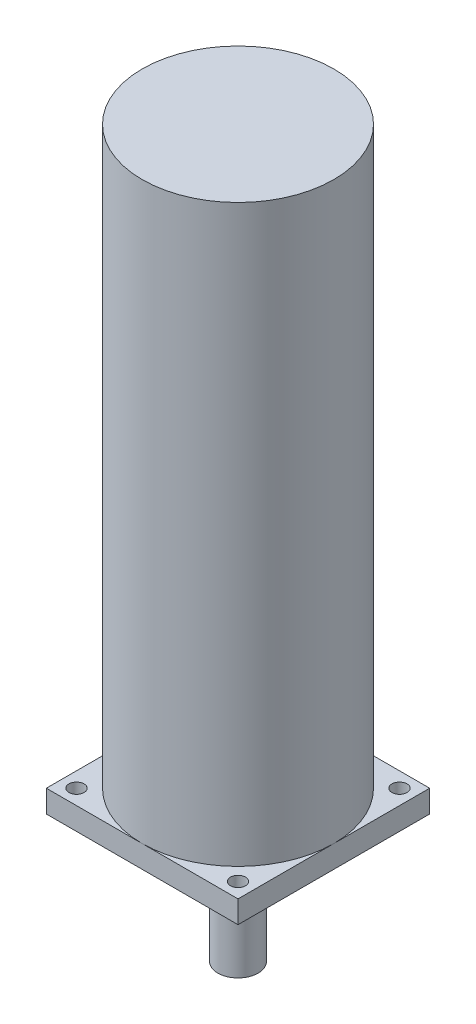
ISO-10303-21;
HEADER;
FILE_DESCRIPTION(('STEP AP214'),'2;1');
FILE_NAME('part.step','',(''),(''),'','','');
FILE_SCHEMA(('AUTOMOTIVE_DESIGN { 1 0 10303 214 1 1 1 1 }'));
ENDSEC;
DATA;
#1=APPLICATION_CONTEXT('core data for automotive mechanical design processes');
#2=APPLICATION_PROTOCOL_DEFINITION('international standard','automotive_design',2000,#1);
#3=PRODUCT_CONTEXT('',#1,'mechanical');
#4=PRODUCT('Part','Part','',(#3));
#5=PRODUCT_RELATED_PRODUCT_CATEGORY('part','',(#4));
#6=PRODUCT_DEFINITION_FORMATION('','',#4);
#7=PRODUCT_DEFINITION_CONTEXT('part definition',#1,'design');
#8=PRODUCT_DEFINITION('design','',#6,#7);
#9=PRODUCT_DEFINITION_SHAPE('','',#8);
#10=(LENGTH_UNIT() NAMED_UNIT(*) SI_UNIT(.MILLI.,.METRE.));
#11=(NAMED_UNIT(*) PLANE_ANGLE_UNIT() SI_UNIT($,.RADIAN.));
#12=(NAMED_UNIT(*) SI_UNIT($,.STERADIAN.) SOLID_ANGLE_UNIT());
#13=UNCERTAINTY_MEASURE_WITH_UNIT(LENGTH_MEASURE(1.E-05),#10,'distance_accuracy_value','');
#14=(GEOMETRIC_REPRESENTATION_CONTEXT(3) GLOBAL_UNCERTAINTY_ASSIGNED_CONTEXT((#13)) GLOBAL_UNIT_ASSIGNED_CONTEXT((#10,
#11,#12)) REPRESENTATION_CONTEXT('',''));
#15=CARTESIAN_POINT('',(0.,0.,0.));
#16=DIRECTION('',(0.,0.,1.));
#17=DIRECTION('',(1.,0.,0.));
#18=AXIS2_PLACEMENT_3D('',#15,#16,#17);
#19=CARTESIAN_POINT('',(0.,4.445,0.));
#20=DIRECTION('',(0.,-1.,0.));
#21=DIRECTION('',(0.,0.,-1.));
#22=AXIS2_PLACEMENT_3D('',#19,#20,#21);
#23=PLANE('',#22);
#24=CARTESIAN_POINT('',(0.,4.445,0.));
#25=DIRECTION('',(0.,1.,0.));
#26=DIRECTION('',(0.,0.,1.));
#27=AXIS2_PLACEMENT_3D('',#24,#25,#26);
#28=CIRCLE('',#27,19.05);
#29=CARTESIAN_POINT('',(0.,4.445,19.05));
#30=VERTEX_POINT('',#29);
#31=CARTESIAN_POINT('',(19.05,4.445,0.));
#32=VERTEX_POINT('',#31);
#33=EDGE_CURVE('E44',#30,#32,#28,.T.);
#34=ORIENTED_EDGE('',*,*,#33,.F.);
#35=DIRECTION('',(1.,0.,0.));
#36=VECTOR('',#35,1.);
#37=CARTESIAN_POINT('',(-19.05,4.445,19.05));
#38=LINE('',#37,#36);
#39=CARTESIAN_POINT('',(19.05,4.445,19.05));
#40=VERTEX_POINT('',#39);
#41=EDGE_CURVE('E96',#30,#40,#38,.T.);
#42=ORIENTED_EDGE('',*,*,#41,.T.);
#43=DIRECTION('',(0.,0.,-1.));
#44=VECTOR('',#43,1.);
#45=CARTESIAN_POINT('',(19.05,4.445,19.05));
#46=LINE('',#45,#44);
#47=EDGE_CURVE('E108',#40,#32,#46,.T.);
#48=ORIENTED_EDGE('',*,*,#47,.T.);
#49=EDGE_LOOP('',(#34,#42,#48));
#50=FACE_BOUND('',#49,.T.);
#51=CARTESIAN_POINT('',(16.050006,4.445,16.050006));
#52=DIRECTION('',(0.,1.,0.));
#53=DIRECTION('',(0.,0.,1.));
#54=AXIS2_PLACEMENT_3D('',#51,#52,#53);
#55=CIRCLE('',#54,1.499997);
#56=CARTESIAN_POINT('',(16.050006,4.445,17.550003));
#57=VERTEX_POINT('',#56);
#58=EDGE_CURVE('E125',#57,#57,#55,.T.);
#59=ORIENTED_EDGE('',*,*,#58,.F.);
#60=EDGE_LOOP('',(#59));
#61=FACE_BOUND('',#60,.T.);
#62=ADVANCED_FACE('F33',(#50,#61),#23,.F.);
#63=CARTESIAN_POINT('',(0.,4.445,-19.05));
#64=VERTEX_POINT('',#63);
#65=EDGE_CURVE('E11',#32,#64,#28,.T.);
#66=ORIENTED_EDGE('',*,*,#65,.F.);
#67=CARTESIAN_POINT('',(19.05,4.445,-19.05));
#68=VERTEX_POINT('',#67);
#69=EDGE_CURVE('E145',#32,#68,#46,.T.);
#70=ORIENTED_EDGE('',*,*,#69,.T.);
#71=DIRECTION('',(-1.,0.,0.));
#72=VECTOR('',#71,1.);
#73=CARTESIAN_POINT('',(-19.05,4.445,-19.05));
#74=LINE('',#73,#72);
#75=EDGE_CURVE('E146',#68,#64,#74,.T.);
#76=ORIENTED_EDGE('',*,*,#75,.T.);
#77=EDGE_LOOP('',(#66,#70,#76));
#78=FACE_BOUND('',#77,.T.);
#79=CARTESIAN_POINT('',(16.050006,4.445,-16.050006));
#80=DIRECTION('',(0.,1.,0.));
#81=DIRECTION('',(0.,0.,-1.));
#82=AXIS2_PLACEMENT_3D('',#79,#80,#81);
#83=CIRCLE('',#82,1.499997);
#84=CARTESIAN_POINT('',(16.050006,4.445,-17.550003));
#85=VERTEX_POINT('',#84);
#86=EDGE_CURVE('E131',#85,#85,#83,.T.);
#87=ORIENTED_EDGE('',*,*,#86,.F.);
#88=EDGE_LOOP('',(#87));
#89=FACE_BOUND('',#88,.T.);
#90=ADVANCED_FACE('F177',(#78,#89),#23,.F.);
#91=CARTESIAN_POINT('',(-19.05,4.445,0.));
#92=VERTEX_POINT('',#91);
#93=EDGE_CURVE('E42',#64,#92,#28,.T.);
#94=ORIENTED_EDGE('',*,*,#93,.F.);
#95=CARTESIAN_POINT('',(-19.05,4.445,-19.05));
#96=VERTEX_POINT('',#95);
#97=EDGE_CURVE('E144',#64,#96,#74,.T.);
#98=ORIENTED_EDGE('',*,*,#97,.T.);
#99=DIRECTION('',(0.,0.,1.));
#100=VECTOR('',#99,1.);
#101=CARTESIAN_POINT('',(-19.05,4.445,19.05));
#102=LINE('',#101,#100);
#103=EDGE_CURVE('E105',#96,#92,#102,.T.);
#104=ORIENTED_EDGE('',*,*,#103,.T.);
#105=EDGE_LOOP('',(#94,#98,#104));
#106=FACE_BOUND('',#105,.T.);
#107=CARTESIAN_POINT('',(-16.050006,4.445,-16.050006));
#108=DIRECTION('',(0.,1.,0.));
#109=DIRECTION('',(0.,0.,1.));
#110=AXIS2_PLACEMENT_3D('',#107,#108,#109);
#111=CIRCLE('',#110,1.499997);
#112=CARTESIAN_POINT('',(-16.050006,4.445,-14.550009));
#113=VERTEX_POINT('',#112);
#114=EDGE_CURVE('E137',#113,#113,#111,.T.);
#115=ORIENTED_EDGE('',*,*,#114,.F.);
#116=EDGE_LOOP('',(#115));
#117=FACE_BOUND('',#116,.T.);
#118=ADVANCED_FACE('F180',(#106,#117),#23,.F.);
#119=EDGE_CURVE('E51',#92,#30,#28,.T.);
#120=ORIENTED_EDGE('',*,*,#119,.F.);
#121=CARTESIAN_POINT('',(-19.05,4.445,19.05));
#122=VERTEX_POINT('',#121);
#123=EDGE_CURVE('E91',#92,#122,#102,.T.);
#124=ORIENTED_EDGE('',*,*,#123,.T.);
#125=EDGE_CURVE('E87',#122,#30,#38,.T.);
#126=ORIENTED_EDGE('',*,*,#125,.T.);
#127=EDGE_LOOP('',(#120,#124,#126));
#128=FACE_BOUND('',#127,.T.);
#129=CARTESIAN_POINT('',(-16.050006,4.445,16.050006));
#130=DIRECTION('',(0.,1.,0.));
#131=DIRECTION('',(0.,0.,-1.));
#132=AXIS2_PLACEMENT_3D('',#129,#130,#131);
#133=CIRCLE('',#132,1.499997);
#134=CARTESIAN_POINT('',(-16.050006,4.445,14.550009));
#135=VERTEX_POINT('',#134);
#136=EDGE_CURVE('E118',#135,#135,#133,.T.);
#137=ORIENTED_EDGE('',*,*,#136,.F.);
#138=EDGE_LOOP('',(#137));
#139=FACE_BOUND('',#138,.T.);
#140=ADVANCED_FACE('F89',(#128,#139),#23,.F.);
#141=CARTESIAN_POINT('',(0.,0.,0.));
#142=DIRECTION('',(0.,-1.,0.));
#143=DIRECTION('',(0.,0.,-1.));
#144=AXIS2_PLACEMENT_3D('',#141,#142,#143);
#145=PLANE('',#144);
#146=CARTESIAN_POINT('',(0.,0.,0.));
#147=DIRECTION('',(0.,-1.,0.));
#148=DIRECTION('',(0.,0.,-1.));
#149=AXIS2_PLACEMENT_3D('',#146,#147,#148);
#150=CIRCLE('',#149,4.);
#151=CARTESIAN_POINT('',(0.,0.,-4.));
#152=VERTEX_POINT('',#151);
#153=EDGE_CURVE('E237',#152,#152,#150,.T.);
#154=ORIENTED_EDGE('',*,*,#153,.F.);
#155=EDGE_LOOP('',(#154));
#156=FACE_BOUND('',#155,.T.);
#157=CARTESIAN_POINT('',(16.050006,0.,16.050006));
#158=DIRECTION('',(0.,1.,0.));
#159=DIRECTION('',(0.,0.,1.));
#160=AXIS2_PLACEMENT_3D('',#157,#158,#159);
#161=CIRCLE('',#160,1.499997);
#162=CARTESIAN_POINT('',(16.050006,0.,17.550003));
#163=VERTEX_POINT('',#162);
#164=EDGE_CURVE('E121',#163,#163,#161,.T.);
#165=ORIENTED_EDGE('',*,*,#164,.T.);
#166=EDGE_LOOP('',(#165));
#167=FACE_BOUND('',#166,.T.);
#168=CARTESIAN_POINT('',(-16.050006,0.,-16.050006));
#169=DIRECTION('',(0.,1.,0.));
#170=DIRECTION('',(0.,0.,1.));
#171=AXIS2_PLACEMENT_3D('',#168,#169,#170);
#172=CIRCLE('',#171,1.499997);
#173=CARTESIAN_POINT('',(-16.050006,0.,-14.550009));
#174=VERTEX_POINT('',#173);
#175=EDGE_CURVE('E134',#174,#174,#172,.T.);
#176=ORIENTED_EDGE('',*,*,#175,.T.);
#177=EDGE_LOOP('',(#176));
#178=FACE_BOUND('',#177,.T.);
#179=DIRECTION('',(0.,0.,-1.));
#180=VECTOR('',#179,1.);
#181=CARTESIAN_POINT('',(19.05,0.,19.05));
#182=LINE('',#181,#180);
#183=CARTESIAN_POINT('',(19.05,0.,19.05));
#184=VERTEX_POINT('',#183);
#185=CARTESIAN_POINT('',(19.05,0.,-19.05));
#186=VERTEX_POINT('',#185);
#187=EDGE_CURVE('E140',#184,#186,#182,.T.);
#188=ORIENTED_EDGE('',*,*,#187,.F.);
#189=DIRECTION('',(1.,0.,0.));
#190=VECTOR('',#189,1.);
#191=CARTESIAN_POINT('',(-19.05,0.,19.05));
#192=LINE('',#191,#190);
#193=CARTESIAN_POINT('',(-19.05,0.,19.05));
#194=VERTEX_POINT('',#193);
#195=EDGE_CURVE('E156',#194,#184,#192,.T.);
#196=ORIENTED_EDGE('',*,*,#195,.F.);
#197=DIRECTION('',(0.,0.,1.));
#198=VECTOR('',#197,1.);
#199=CARTESIAN_POINT('',(-19.05,0.,19.05));
#200=LINE('',#199,#198);
#201=CARTESIAN_POINT('',(-19.05,0.,-19.05));
#202=VERTEX_POINT('',#201);
#203=EDGE_CURVE('E154',#202,#194,#200,.T.);
#204=ORIENTED_EDGE('',*,*,#203,.F.);
#205=DIRECTION('',(-1.,0.,0.));
#206=VECTOR('',#205,1.);
#207=CARTESIAN_POINT('',(-19.05,0.,-19.05));
#208=LINE('',#207,#206);
#209=EDGE_CURVE('E152',#186,#202,#208,.T.);
#210=ORIENTED_EDGE('',*,*,#209,.F.);
#211=EDGE_LOOP('',(#188,#196,#204,#210));
#212=FACE_BOUND('',#211,.T.);
#213=CARTESIAN_POINT('',(16.050006,0.,-16.050006));
#214=DIRECTION('',(0.,1.,0.));
#215=DIRECTION('',(0.,0.,-1.));
#216=AXIS2_PLACEMENT_3D('',#213,#214,#215);
#217=CIRCLE('',#216,1.499997);
#218=CARTESIAN_POINT('',(16.050006,0.,-17.550003));
#219=VERTEX_POINT('',#218);
#220=EDGE_CURVE('E128',#219,#219,#217,.T.);
#221=ORIENTED_EDGE('',*,*,#220,.T.);
#222=EDGE_LOOP('',(#221));
#223=FACE_BOUND('',#222,.T.);
#224=CARTESIAN_POINT('',(-16.050006,0.,16.050006));
#225=DIRECTION('',(0.,1.,0.));
#226=DIRECTION('',(0.,0.,-1.));
#227=AXIS2_PLACEMENT_3D('',#224,#225,#226);
#228=CIRCLE('',#227,1.499997);
#229=CARTESIAN_POINT('',(-16.050006,0.,14.550009));
#230=VERTEX_POINT('',#229);
#231=EDGE_CURVE('E122',#230,#230,#228,.T.);
#232=ORIENTED_EDGE('',*,*,#231,.T.);
#233=EDGE_LOOP('',(#232));
#234=FACE_BOUND('',#233,.T.);
#235=ADVANCED_FACE('F170',(#156,#167,#178,#212,#223,#234),#145,.T.);
#236=CARTESIAN_POINT('',(19.05,4.445,19.05));
#237=DIRECTION('',(-1.,0.,0.));
#238=DIRECTION('',(0.,0.,1.));
#239=AXIS2_PLACEMENT_3D('',#236,#237,#238);
#240=PLANE('',#239);
#241=ORIENTED_EDGE('',*,*,#187,.T.);
#242=DIRECTION('',(0.,-1.,0.));
#243=VECTOR('',#242,1.);
#244=CARTESIAN_POINT('',(19.05,4.445,-19.05));
#245=LINE('',#244,#243);
#246=EDGE_CURVE('E37',#68,#186,#245,.T.);
#247=ORIENTED_EDGE('',*,*,#246,.F.);
#248=ORIENTED_EDGE('',*,*,#69,.F.);
#249=ORIENTED_EDGE('',*,*,#47,.F.);
#250=DIRECTION('',(0.,-1.,0.));
#251=VECTOR('',#250,1.);
#252=CARTESIAN_POINT('',(19.05,4.445,19.05));
#253=LINE('',#252,#251);
#254=EDGE_CURVE('E95',#40,#184,#253,.T.);
#255=ORIENTED_EDGE('',*,*,#254,.T.);
#256=EDGE_LOOP('',(#241,#247,#248,#249,#255));
#257=FACE_BOUND('',#256,.T.);
#258=ADVANCED_FACE('F35',(#257),#240,.F.);
#259=CARTESIAN_POINT('',(-19.05,4.445,-19.05));
#260=DIRECTION('',(0.,0.,1.));
#261=DIRECTION('',(1.,0.,0.));
#262=AXIS2_PLACEMENT_3D('',#259,#260,#261);
#263=PLANE('',#262);
#264=ORIENTED_EDGE('',*,*,#209,.T.);
#265=DIRECTION('',(0.,-1.,0.));
#266=VECTOR('',#265,1.);
#267=CARTESIAN_POINT('',(-19.05,4.445,-19.05));
#268=LINE('',#267,#266);
#269=EDGE_CURVE('E114',#96,#202,#268,.T.);
#270=ORIENTED_EDGE('',*,*,#269,.F.);
#271=ORIENTED_EDGE('',*,*,#97,.F.);
#272=ORIENTED_EDGE('',*,*,#75,.F.);
#273=ORIENTED_EDGE('',*,*,#246,.T.);
#274=EDGE_LOOP('',(#264,#270,#271,#272,#273));
#275=FACE_BOUND('',#274,.T.);
#276=ADVANCED_FACE('F179',(#275),#263,.F.);
#277=CARTESIAN_POINT('',(-19.05,4.445,19.05));
#278=DIRECTION('',(1.,0.,0.));
#279=DIRECTION('',(0.,0.,-1.));
#280=AXIS2_PLACEMENT_3D('',#277,#278,#279);
#281=PLANE('',#280);
#282=ORIENTED_EDGE('',*,*,#203,.T.);
#283=DIRECTION('',(0.,-1.,0.));
#284=VECTOR('',#283,1.);
#285=CARTESIAN_POINT('',(-19.05,4.445,19.05));
#286=LINE('',#285,#284);
#287=EDGE_CURVE('E159',#122,#194,#286,.T.);
#288=ORIENTED_EDGE('',*,*,#287,.F.);
#289=ORIENTED_EDGE('',*,*,#123,.F.);
#290=ORIENTED_EDGE('',*,*,#103,.F.);
#291=ORIENTED_EDGE('',*,*,#269,.T.);
#292=EDGE_LOOP('',(#282,#288,#289,#290,#291));
#293=FACE_BOUND('',#292,.T.);
#294=ADVANCED_FACE('F165',(#293),#281,.F.);
#295=CARTESIAN_POINT('',(-19.05,4.445,19.05));
#296=DIRECTION('',(0.,0.,-1.));
#297=DIRECTION('',(-1.,0.,0.));
#298=AXIS2_PLACEMENT_3D('',#295,#296,#297);
#299=PLANE('',#298);
#300=ORIENTED_EDGE('',*,*,#195,.T.);
#301=ORIENTED_EDGE('',*,*,#254,.F.);
#302=ORIENTED_EDGE('',*,*,#41,.F.);
#303=ORIENTED_EDGE('',*,*,#125,.F.);
#304=ORIENTED_EDGE('',*,*,#287,.T.);
#305=EDGE_LOOP('',(#300,#301,#302,#303,#304));
#306=FACE_BOUND('',#305,.T.);
#307=ADVANCED_FACE('F100',(#306),#299,.F.);
#308=CARTESIAN_POINT('',(-16.050006,4.445,-16.050006));
#309=DIRECTION('',(0.,-1.,0.));
#310=DIRECTION('',(0.,0.,-1.));
#311=AXIS2_PLACEMENT_3D('',#308,#309,#310);
#312=CYLINDRICAL_SURFACE('',#311,1.499997);
#313=ORIENTED_EDGE('',*,*,#114,.T.);
#314=EDGE_LOOP('',(#313));
#315=FACE_BOUND('',#314,.T.);
#316=ORIENTED_EDGE('',*,*,#175,.F.);
#317=EDGE_LOOP('',(#316));
#318=FACE_BOUND('',#317,.T.);
#319=ADVANCED_FACE('F186',(#315,#318),#312,.F.);
#320=CARTESIAN_POINT('',(16.050006,4.445,-16.050006));
#321=DIRECTION('',(0.,-1.,0.));
#322=DIRECTION('',(0.,0.,-1.));
#323=AXIS2_PLACEMENT_3D('',#320,#321,#322);
#324=CYLINDRICAL_SURFACE('',#323,1.499997);
#325=ORIENTED_EDGE('',*,*,#86,.T.);
#326=EDGE_LOOP('',(#325));
#327=FACE_BOUND('',#326,.T.);
#328=ORIENTED_EDGE('',*,*,#220,.F.);
#329=EDGE_LOOP('',(#328));
#330=FACE_BOUND('',#329,.T.);
#331=ADVANCED_FACE('F189',(#327,#330),#324,.F.);
#332=CARTESIAN_POINT('',(16.050006,4.445,16.050006));
#333=DIRECTION('',(0.,-1.,0.));
#334=DIRECTION('',(0.,0.,-1.));
#335=AXIS2_PLACEMENT_3D('',#332,#333,#334);
#336=CYLINDRICAL_SURFACE('',#335,1.499997);
#337=ORIENTED_EDGE('',*,*,#58,.T.);
#338=EDGE_LOOP('',(#337));
#339=FACE_BOUND('',#338,.T.);
#340=ORIENTED_EDGE('',*,*,#164,.F.);
#341=EDGE_LOOP('',(#340));
#342=FACE_BOUND('',#341,.T.);
#343=ADVANCED_FACE('F210',(#339,#342),#336,.F.);
#344=CARTESIAN_POINT('',(-16.050006,4.445,16.050006));
#345=DIRECTION('',(0.,-1.,0.));
#346=DIRECTION('',(0.,0.,-1.));
#347=AXIS2_PLACEMENT_3D('',#344,#345,#346);
#348=CYLINDRICAL_SURFACE('',#347,1.499997);
#349=ORIENTED_EDGE('',*,*,#136,.T.);
#350=EDGE_LOOP('',(#349));
#351=FACE_BOUND('',#350,.T.);
#352=ORIENTED_EDGE('',*,*,#231,.F.);
#353=EDGE_LOOP('',(#352));
#354=FACE_BOUND('',#353,.T.);
#355=ADVANCED_FACE('F214',(#351,#354),#348,.F.);
#356=CARTESIAN_POINT('',(0.,118.745,0.));
#357=DIRECTION('',(0.,-1.,0.));
#358=DIRECTION('',(0.,0.,-1.));
#359=AXIS2_PLACEMENT_3D('',#356,#357,#358);
#360=CYLINDRICAL_SURFACE('',#359,19.05);
#361=CARTESIAN_POINT('',(0.,118.745,0.));
#362=DIRECTION('',(0.,1.,0.));
#363=DIRECTION('',(0.,0.,1.));
#364=AXIS2_PLACEMENT_3D('',#361,#362,#363);
#365=CIRCLE('',#364,19.05);
#366=CARTESIAN_POINT('',(0.,118.745,19.05));
#367=VERTEX_POINT('',#366);
#368=EDGE_CURVE('E110',#367,#367,#365,.T.);
#369=ORIENTED_EDGE('',*,*,#368,.F.);
#370=EDGE_LOOP('',(#369));
#371=FACE_BOUND('',#370,.T.);
#372=ORIENTED_EDGE('',*,*,#33,.T.);
#373=ORIENTED_EDGE('',*,*,#65,.T.);
#374=ORIENTED_EDGE('',*,*,#93,.T.);
#375=ORIENTED_EDGE('',*,*,#119,.T.);
#376=EDGE_LOOP('',(#372,#373,#374,#375));
#377=FACE_BOUND('',#376,.T.);
#378=ADVANCED_FACE('F112',(#371,#377),#360,.T.);
#379=CARTESIAN_POINT('',(0.,118.745,0.));
#380=DIRECTION('',(0.,1.,0.));
#381=DIRECTION('',(0.,0.,1.));
#382=AXIS2_PLACEMENT_3D('',#379,#380,#381);
#383=PLANE('',#382);
#384=ORIENTED_EDGE('',*,*,#368,.T.);
#385=EDGE_LOOP('',(#384));
#386=FACE_BOUND('',#385,.T.);
#387=ADVANCED_FACE('F221',(#386),#383,.T.);
#388=CARTESIAN_POINT('',(0.,-25.4,0.));
#389=DIRECTION('',(0.,1.,0.));
#390=DIRECTION('',(0.,0.,1.));
#391=AXIS2_PLACEMENT_3D('',#388,#389,#390);
#392=CYLINDRICAL_SURFACE('',#391,4.);
#393=CARTESIAN_POINT('',(0.,-25.4,0.));
#394=DIRECTION('',(0.,-1.,0.));
#395=DIRECTION('',(0.,0.,-1.));
#396=AXIS2_PLACEMENT_3D('',#393,#394,#395);
#397=CIRCLE('',#396,4.);
#398=CARTESIAN_POINT('',(0.,-25.4,-4.));
#399=VERTEX_POINT('',#398);
#400=EDGE_CURVE('E111',#399,#399,#397,.T.);
#401=ORIENTED_EDGE('',*,*,#400,.F.);
#402=EDGE_LOOP('',(#401));
#403=FACE_BOUND('',#402,.T.);
#404=ORIENTED_EDGE('',*,*,#153,.T.);
#405=EDGE_LOOP('',(#404));
#406=FACE_BOUND('',#405,.T.);
#407=ADVANCED_FACE('F225',(#403,#406),#392,.T.);
#408=CARTESIAN_POINT('',(0.,-25.4,0.));
#409=DIRECTION('',(0.,-1.,0.));
#410=DIRECTION('',(0.,0.,-1.));
#411=AXIS2_PLACEMENT_3D('',#408,#409,#410);
#412=PLANE('',#411);
#413=ORIENTED_EDGE('',*,*,#400,.T.);
#414=EDGE_LOOP('',(#413));
#415=FACE_BOUND('',#414,.T.);
#416=ADVANCED_FACE('F229',(#415),#412,.T.);
#417=CLOSED_SHELL('',(#62,#90,#118,#140,#235,#258,#276,#294,#307,#319,#331,#343,#355,#378,#387,
#407,#416));
#418=MANIFOLD_SOLID_BREP('B2',#417);
#419=ADVANCED_BREP_SHAPE_REPRESENTATION('',(#18,#418),#14);
#420=SHAPE_DEFINITION_REPRESENTATION(#9,#419);
ENDSEC;
END-ISO-10303-21;
